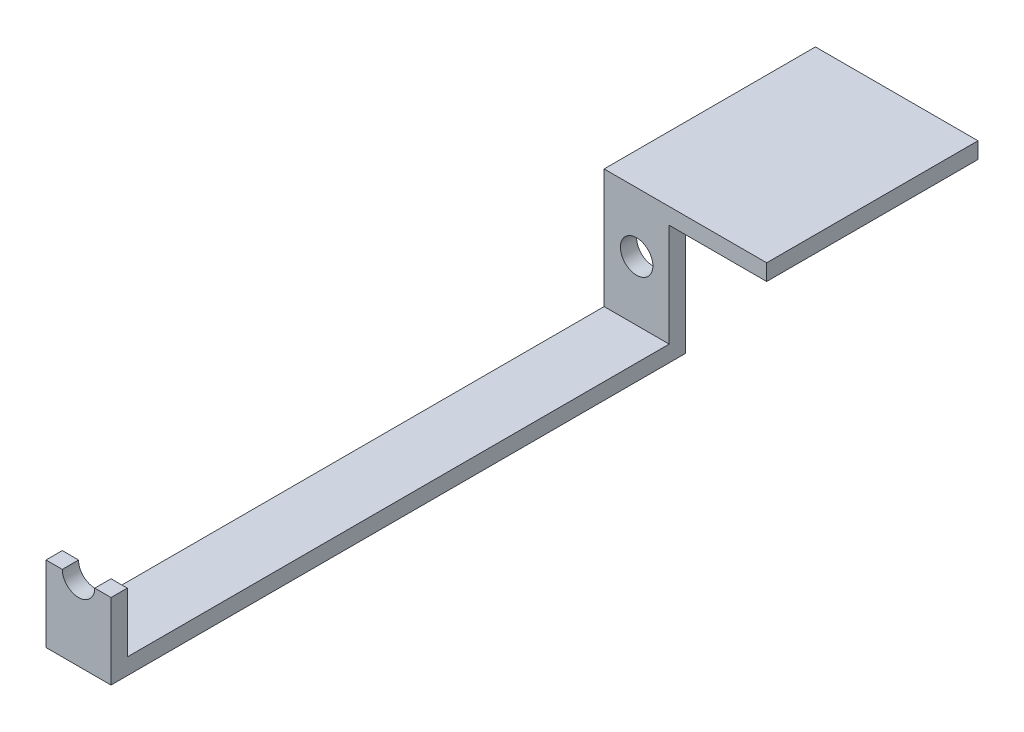
ISO-10303-21;
HEADER;
FILE_DESCRIPTION(('STEP AP214'),'2;1');
FILE_NAME('part.step','',(''),(''),'','','');
FILE_SCHEMA(('AUTOMOTIVE_DESIGN { 1 0 10303 214 1 1 1 1 }'));
ENDSEC;
DATA;
#1=APPLICATION_CONTEXT('core data for automotive mechanical design processes');
#2=APPLICATION_PROTOCOL_DEFINITION('international standard','automotive_design',2000,#1);
#3=PRODUCT_CONTEXT('',#1,'mechanical');
#4=PRODUCT('Part','Part','',(#3));
#5=PRODUCT_RELATED_PRODUCT_CATEGORY('part','',(#4));
#6=PRODUCT_DEFINITION_FORMATION('','',#4);
#7=PRODUCT_DEFINITION_CONTEXT('part definition',#1,'design');
#8=PRODUCT_DEFINITION('design','',#6,#7);
#9=PRODUCT_DEFINITION_SHAPE('','',#8);
#10=(LENGTH_UNIT() NAMED_UNIT(*) SI_UNIT(.MILLI.,.METRE.));
#11=(NAMED_UNIT(*) PLANE_ANGLE_UNIT() SI_UNIT($,.RADIAN.));
#12=(NAMED_UNIT(*) SI_UNIT($,.STERADIAN.) SOLID_ANGLE_UNIT());
#13=UNCERTAINTY_MEASURE_WITH_UNIT(LENGTH_MEASURE(1.E-05),#10,'distance_accuracy_value','');
#14=(GEOMETRIC_REPRESENTATION_CONTEXT(3) GLOBAL_UNCERTAINTY_ASSIGNED_CONTEXT((#13)) GLOBAL_UNIT_ASSIGNED_CONTEXT((#10,
#11,#12)) REPRESENTATION_CONTEXT('',''));
#15=CARTESIAN_POINT('',(0.,0.,0.));
#16=DIRECTION('',(0.,0.,1.));
#17=DIRECTION('',(1.,0.,0.));
#18=AXIS2_PLACEMENT_3D('',#15,#16,#17);
#19=CARTESIAN_POINT('',(12.,0.,0.));
#20=DIRECTION('',(-1.,0.,0.));
#21=DIRECTION('',(0.,0.,1.));
#22=AXIS2_PLACEMENT_3D('',#19,#20,#21);
#23=PLANE('',#22);
#24=DIRECTION('',(0.,0.,-1.));
#25=VECTOR('',#24,1.);
#26=CARTESIAN_POINT('',(12.,22.,-89.));
#27=LINE('',#26,#25);
#28=CARTESIAN_POINT('',(12.,22.,-50.));
#29=VERTEX_POINT('',#28);
#30=CARTESIAN_POINT('',(12.,22.,-53.));
#31=VERTEX_POINT('',#30);
#32=EDGE_CURVE('E52',#29,#31,#27,.T.);
#33=ORIENTED_EDGE('',*,*,#32,.F.);
#34=DIRECTION('',(0.,-1.,0.));
#35=VECTOR('',#34,1.);
#36=CARTESIAN_POINT('',(12.,20.,-50.));
#37=LINE('',#36,#35);
#38=CARTESIAN_POINT('',(12.,3.00000000000001,-50.));
#39=VERTEX_POINT('',#38);
#40=EDGE_CURVE('E192',#29,#39,#37,.T.);
#41=ORIENTED_EDGE('',*,*,#40,.T.);
#42=DIRECTION('',(0.,0.,1.));
#43=VECTOR('',#42,1.);
#44=CARTESIAN_POINT('',(12.,3.00000000000001,-50.));
#45=LINE('',#44,#43);
#46=CARTESIAN_POINT('',(12.,3.00000000000001,50.));
#47=VERTEX_POINT('',#46);
#48=EDGE_CURVE('E189',#39,#47,#45,.T.);
#49=ORIENTED_EDGE('',*,*,#48,.T.);
#50=DIRECTION('',(0.,1.,0.));
#51=VECTOR('',#50,1.);
#52=CARTESIAN_POINT('',(12.,14.,50.));
#53=LINE('',#52,#51);
#54=CARTESIAN_POINT('',(12.,14.,50.));
#55=VERTEX_POINT('',#54);
#56=EDGE_CURVE('E215',#47,#55,#53,.T.);
#57=ORIENTED_EDGE('',*,*,#56,.T.);
#58=DIRECTION('',(0.,0.,1.));
#59=VECTOR('',#58,1.);
#60=CARTESIAN_POINT('',(12.,14.,53.));
#61=LINE('',#60,#59);
#62=CARTESIAN_POINT('',(12.,14.,53.));
#63=VERTEX_POINT('',#62);
#64=EDGE_CURVE('E178',#55,#63,#61,.T.);
#65=ORIENTED_EDGE('',*,*,#64,.T.);
#66=DIRECTION('',(0.,-1.,0.));
#67=VECTOR('',#66,1.);
#68=CARTESIAN_POINT('',(12.,0.,53.));
#69=LINE('',#68,#67);
#70=CARTESIAN_POINT('',(12.,0.,53.));
#71=VERTEX_POINT('',#70);
#72=EDGE_CURVE('E181',#63,#71,#69,.T.);
#73=ORIENTED_EDGE('',*,*,#72,.T.);
#74=DIRECTION('',(0.,0.,-1.));
#75=VECTOR('',#74,1.);
#76=CARTESIAN_POINT('',(12.,0.,53.));
#77=LINE('',#76,#75);
#78=CARTESIAN_POINT('',(12.,0.,-53.));
#79=VERTEX_POINT('',#78);
#80=EDGE_CURVE('E184',#71,#79,#77,.T.);
#81=ORIENTED_EDGE('',*,*,#80,.T.);
#82=DIRECTION('',(0.,1.,0.));
#83=VECTOR('',#82,1.);
#84=CARTESIAN_POINT('',(12.,0.,-53.));
#85=LINE('',#84,#83);
#86=EDGE_CURVE('E186',#79,#31,#85,.T.);
#87=ORIENTED_EDGE('',*,*,#86,.T.);
#88=EDGE_LOOP('',(#33,#41,#49,#57,#65,#73,#81,#87));
#89=FACE_BOUND('',#88,.T.);
#90=ADVANCED_FACE('F35',(#89),#23,.F.);
#91=CARTESIAN_POINT('',(12.,14.,53.));
#92=DIRECTION('',(0.,-1.,0.));
#93=DIRECTION('',(0.,0.,-1.));
#94=AXIS2_PLACEMENT_3D('',#91,#92,#93);
#95=PLANE('',#94);
#96=DIRECTION('',(-1.,0.,0.));
#97=VECTOR('',#96,1.);
#98=CARTESIAN_POINT('',(12.,14.,53.));
#99=LINE('',#98,#97);
#100=CARTESIAN_POINT('',(3.,14.,53.));
#101=VERTEX_POINT('',#100);
#102=CARTESIAN_POINT('',(0.,14.,53.));
#103=VERTEX_POINT('',#102);
#104=EDGE_CURVE('E260',#101,#103,#99,.T.);
#105=ORIENTED_EDGE('',*,*,#104,.F.);
#106=DIRECTION('',(0.,0.,-1.));
#107=VECTOR('',#106,1.);
#108=CARTESIAN_POINT('',(3.,14.,61.4852813742386));
#109=LINE('',#108,#107);
#110=CARTESIAN_POINT('',(3.,14.,50.));
#111=VERTEX_POINT('',#110);
#112=EDGE_CURVE('E171',#101,#111,#109,.T.);
#113=ORIENTED_EDGE('',*,*,#112,.T.);
#114=DIRECTION('',(-1.,0.,0.));
#115=VECTOR('',#114,1.);
#116=CARTESIAN_POINT('',(12.,14.,50.));
#117=LINE('',#116,#115);
#118=CARTESIAN_POINT('',(0.,14.,50.));
#119=VERTEX_POINT('',#118);
#120=EDGE_CURVE('E232',#111,#119,#117,.T.);
#121=ORIENTED_EDGE('',*,*,#120,.T.);
#122=DIRECTION('',(0.,0.,1.));
#123=VECTOR('',#122,1.);
#124=CARTESIAN_POINT('',(0.,14.,53.));
#125=LINE('',#124,#123);
#126=EDGE_CURVE('E177',#119,#103,#125,.T.);
#127=ORIENTED_EDGE('',*,*,#126,.T.);
#128=EDGE_LOOP('',(#105,#113,#121,#127));
#129=FACE_BOUND('',#128,.T.);
#130=ADVANCED_FACE('F274',(#129),#95,.F.);
#131=CARTESIAN_POINT('',(9.,14.,50.));
#132=VERTEX_POINT('',#131);
#133=EDGE_CURVE('E226',#55,#132,#117,.T.);
#134=ORIENTED_EDGE('',*,*,#133,.T.);
#135=DIRECTION('',(0.,0.,-1.));
#136=VECTOR('',#135,1.);
#137=CARTESIAN_POINT('',(9.,14.,61.4852813742386));
#138=LINE('',#137,#136);
#139=CARTESIAN_POINT('',(9.,14.,53.));
#140=VERTEX_POINT('',#139);
#141=EDGE_CURVE('E60',#132,#140,#138,.F.);
#142=ORIENTED_EDGE('',*,*,#141,.T.);
#143=EDGE_CURVE('E44',#63,#140,#99,.T.);
#144=ORIENTED_EDGE('',*,*,#143,.F.);
#145=ORIENTED_EDGE('',*,*,#64,.F.);
#146=EDGE_LOOP('',(#134,#142,#144,#145));
#147=FACE_BOUND('',#146,.T.);
#148=ADVANCED_FACE('F37',(#147),#95,.F.);
#149=CARTESIAN_POINT('',(12.,0.,53.));
#150=DIRECTION('',(0.,0.,-1.));
#151=DIRECTION('',(-1.,0.,0.));
#152=AXIS2_PLACEMENT_3D('',#149,#150,#151);
#153=PLANE('',#152);
#154=ORIENTED_EDGE('',*,*,#143,.T.);
#155=CARTESIAN_POINT('',(6.,14.,53.));
#156=DIRECTION('',(0.,0.,-1.));
#157=DIRECTION('',(-1.,0.,0.));
#158=AXIS2_PLACEMENT_3D('',#155,#156,#157);
#159=CIRCLE('',#158,3.);
#160=EDGE_CURVE('E168',#101,#140,#159,.F.);
#161=ORIENTED_EDGE('',*,*,#160,.F.);
#162=ORIENTED_EDGE('',*,*,#104,.T.);
#163=DIRECTION('',(0.,-1.,0.));
#164=VECTOR('',#163,1.);
#165=CARTESIAN_POINT('',(0.,0.,53.));
#166=LINE('',#165,#164);
#167=CARTESIAN_POINT('',(0.,0.,53.));
#168=VERTEX_POINT('',#167);
#169=EDGE_CURVE('E237',#103,#168,#166,.T.);
#170=ORIENTED_EDGE('',*,*,#169,.T.);
#171=DIRECTION('',(-1.,0.,0.));
#172=VECTOR('',#171,1.);
#173=CARTESIAN_POINT('',(12.,0.,53.));
#174=LINE('',#173,#172);
#175=EDGE_CURVE('E258',#71,#168,#174,.T.);
#176=ORIENTED_EDGE('',*,*,#175,.F.);
#177=ORIENTED_EDGE('',*,*,#72,.F.);
#178=EDGE_LOOP('',(#154,#161,#162,#170,#176,#177));
#179=FACE_BOUND('',#178,.T.);
#180=ADVANCED_FACE('F267',(#179),#153,.F.);
#181=CARTESIAN_POINT('',(12.,0.,53.));
#182=DIRECTION('',(0.,1.,0.));
#183=DIRECTION('',(0.,0.,1.));
#184=AXIS2_PLACEMENT_3D('',#181,#182,#183);
#185=PLANE('',#184);
#186=DIRECTION('',(0.,0.,-1.));
#187=VECTOR('',#186,1.);
#188=CARTESIAN_POINT('',(0.,0.,53.));
#189=LINE('',#188,#187);
#190=CARTESIAN_POINT('',(0.,0.,-53.));
#191=VERTEX_POINT('',#190);
#192=EDGE_CURVE('E239',#168,#191,#189,.T.);
#193=ORIENTED_EDGE('',*,*,#192,.T.);
#194=DIRECTION('',(-1.,0.,0.));
#195=VECTOR('',#194,1.);
#196=CARTESIAN_POINT('',(12.,0.,-53.));
#197=LINE('',#196,#195);
#198=EDGE_CURVE('E201',#79,#191,#197,.T.);
#199=ORIENTED_EDGE('',*,*,#198,.F.);
#200=ORIENTED_EDGE('',*,*,#80,.F.);
#201=ORIENTED_EDGE('',*,*,#175,.T.);
#202=EDGE_LOOP('',(#193,#199,#200,#201));
#203=FACE_BOUND('',#202,.T.);
#204=ADVANCED_FACE('F283',(#203),#185,.F.);
#205=CARTESIAN_POINT('',(12.,22.,-53.));
#206=DIRECTION('',(0.,0.,1.));
#207=DIRECTION('',(1.,0.,0.));
#208=AXIS2_PLACEMENT_3D('',#205,#206,#207);
#209=PLANE('',#208);
#210=CARTESIAN_POINT('',(6.,14.,-53.));
#211=DIRECTION('',(0.,0.,-1.));
#212=DIRECTION('',(-1.,0.,0.));
#213=AXIS2_PLACEMENT_3D('',#210,#211,#212);
#214=CIRCLE('',#213,3.);
#215=CARTESIAN_POINT('',(3.,14.,-53.));
#216=VERTEX_POINT('',#215);
#217=EDGE_CURVE('E165',#216,#216,#214,.T.);
#218=ORIENTED_EDGE('',*,*,#217,.F.);
#219=EDGE_LOOP('',(#218));
#220=FACE_BOUND('',#219,.T.);
#221=DIRECTION('',(0.,1.,0.));
#222=VECTOR('',#221,1.);
#223=CARTESIAN_POINT('',(0.,22.,-53.));
#224=LINE('',#223,#222);
#225=CARTESIAN_POINT('',(0.,22.,-53.));
#226=VERTEX_POINT('',#225);
#227=EDGE_CURVE('E242',#191,#226,#224,.T.);
#228=ORIENTED_EDGE('',*,*,#227,.T.);
#229=DIRECTION('',(-1.,0.,0.));
#230=VECTOR('',#229,1.);
#231=CARTESIAN_POINT('',(12.,22.,-53.));
#232=LINE('',#231,#230);
#233=EDGE_CURVE('E198',#31,#226,#232,.T.);
#234=ORIENTED_EDGE('',*,*,#233,.F.);
#235=ORIENTED_EDGE('',*,*,#86,.F.);
#236=ORIENTED_EDGE('',*,*,#198,.T.);
#237=EDGE_LOOP('',(#228,#234,#235,#236));
#238=FACE_BOUND('',#237,.T.);
#239=ADVANCED_FACE('F279',(#220,#238),#209,.F.);
#240=CARTESIAN_POINT('',(12.,22.,-89.));
#241=DIRECTION('',(0.,1.,0.));
#242=DIRECTION('',(0.,0.,1.));
#243=AXIS2_PLACEMENT_3D('',#240,#241,#242);
#244=PLANE('',#243);
#245=DIRECTION('',(0.,0.,-1.));
#246=VECTOR('',#245,1.);
#247=CARTESIAN_POINT('',(0.,22.,-89.));
#248=LINE('',#247,#246);
#249=CARTESIAN_POINT('',(0.,22.,-89.));
#250=VERTEX_POINT('',#249);
#251=EDGE_CURVE('E244',#226,#250,#248,.T.);
#252=ORIENTED_EDGE('',*,*,#251,.T.);
#253=DIRECTION('',(-1.,0.,0.));
#254=VECTOR('',#253,1.);
#255=CARTESIAN_POINT('',(12.,22.,-89.));
#256=LINE('',#255,#254);
#257=CARTESIAN_POINT('',(30.,22.,-89.));
#258=VERTEX_POINT('',#257);
#259=EDGE_CURVE('E142',#258,#250,#256,.T.);
#260=ORIENTED_EDGE('',*,*,#259,.F.);
#261=DIRECTION('',(0.,0.,-1.));
#262=VECTOR('',#261,1.);
#263=CARTESIAN_POINT('',(30.,22.,-89.));
#264=LINE('',#263,#262);
#265=CARTESIAN_POINT('',(30.,22.,-50.));
#266=VERTEX_POINT('',#265);
#267=EDGE_CURVE('E156',#266,#258,#264,.T.);
#268=ORIENTED_EDGE('',*,*,#267,.F.);
#269=DIRECTION('',(-1.,0.,0.));
#270=VECTOR('',#269,1.);
#271=CARTESIAN_POINT('',(30.,22.,-50.));
#272=LINE('',#271,#270);
#273=EDGE_CURVE('E162',#266,#29,#272,.T.);
#274=ORIENTED_EDGE('',*,*,#273,.T.);
#275=ORIENTED_EDGE('',*,*,#32,.T.);
#276=ORIENTED_EDGE('',*,*,#233,.T.);
#277=EDGE_LOOP('',(#252,#260,#268,#274,#275,#276));
#278=FACE_BOUND('',#277,.T.);
#279=ADVANCED_FACE('F206',(#278),#244,.F.);
#280=CARTESIAN_POINT('',(12.,25.,-89.));
#281=DIRECTION('',(0.,0.,1.));
#282=DIRECTION('',(1.,0.,0.));
#283=AXIS2_PLACEMENT_3D('',#280,#281,#282);
#284=PLANE('',#283);
#285=DIRECTION('',(0.,1.,0.));
#286=VECTOR('',#285,1.);
#287=CARTESIAN_POINT('',(0.,25.,-89.));
#288=LINE('',#287,#286);
#289=CARTESIAN_POINT('',(0.,25.,-89.));
#290=VERTEX_POINT('',#289);
#291=EDGE_CURVE('E138',#250,#290,#288,.T.);
#292=ORIENTED_EDGE('',*,*,#291,.T.);
#293=DIRECTION('',(-1.,0.,0.));
#294=VECTOR('',#293,1.);
#295=CARTESIAN_POINT('',(12.,25.,-89.));
#296=LINE('',#295,#294);
#297=CARTESIAN_POINT('',(30.,25.,-89.));
#298=VERTEX_POINT('',#297);
#299=EDGE_CURVE('E131',#298,#290,#296,.T.);
#300=ORIENTED_EDGE('',*,*,#299,.F.);
#301=DIRECTION('',(0.,1.,0.));
#302=VECTOR('',#301,1.);
#303=CARTESIAN_POINT('',(30.,22.,-89.));
#304=LINE('',#303,#302);
#305=EDGE_CURVE('E136',#258,#298,#304,.T.);
#306=ORIENTED_EDGE('',*,*,#305,.F.);
#307=ORIENTED_EDGE('',*,*,#259,.T.);
#308=EDGE_LOOP('',(#292,#300,#306,#307));
#309=FACE_BOUND('',#308,.T.);
#310=ADVANCED_FACE('F133',(#309),#284,.F.);
#311=CARTESIAN_POINT('',(12.,25.,-50.));
#312=DIRECTION('',(0.,-1.,0.));
#313=DIRECTION('',(0.,0.,-1.));
#314=AXIS2_PLACEMENT_3D('',#311,#312,#313);
#315=PLANE('',#314);
#316=DIRECTION('',(0.,0.,1.));
#317=VECTOR('',#316,1.);
#318=CARTESIAN_POINT('',(0.,25.,-50.));
#319=LINE('',#318,#317);
#320=CARTESIAN_POINT('',(0.,25.,-50.));
#321=VERTEX_POINT('',#320);
#322=EDGE_CURVE('E247',#290,#321,#319,.T.);
#323=ORIENTED_EDGE('',*,*,#322,.T.);
#324=DIRECTION('',(-1.,0.,0.));
#325=VECTOR('',#324,1.);
#326=CARTESIAN_POINT('',(12.,25.,-50.));
#327=LINE('',#326,#325);
#328=CARTESIAN_POINT('',(30.,25.,-50.));
#329=VERTEX_POINT('',#328);
#330=EDGE_CURVE('E143',#329,#321,#327,.T.);
#331=ORIENTED_EDGE('',*,*,#330,.F.);
#332=DIRECTION('',(0.,0.,1.));
#333=VECTOR('',#332,1.);
#334=CARTESIAN_POINT('',(30.,25.,-89.));
#335=LINE('',#334,#333);
#336=EDGE_CURVE('E146',#298,#329,#335,.T.);
#337=ORIENTED_EDGE('',*,*,#336,.F.);
#338=ORIENTED_EDGE('',*,*,#299,.T.);
#339=EDGE_LOOP('',(#323,#331,#337,#338));
#340=FACE_BOUND('',#339,.T.);
#341=ADVANCED_FACE('F147',(#340),#315,.F.);
#342=CARTESIAN_POINT('',(12.,20.,-50.));
#343=DIRECTION('',(0.,0.,-1.));
#344=DIRECTION('',(0.,1.,0.));
#345=AXIS2_PLACEMENT_3D('',#342,#343,#344);
#346=PLANE('',#345);
#347=CARTESIAN_POINT('',(6.,14.,-50.));
#348=DIRECTION('',(0.,0.,-1.));
#349=DIRECTION('',(0.,1.,0.));
#350=AXIS2_PLACEMENT_3D('',#347,#348,#349);
#351=CIRCLE('',#350,3.);
#352=CARTESIAN_POINT('',(6.,17.,-50.));
#353=VERTEX_POINT('',#352);
#354=EDGE_CURVE('E174',#353,#353,#351,.T.);
#355=ORIENTED_EDGE('',*,*,#354,.T.);
#356=EDGE_LOOP('',(#355));
#357=FACE_BOUND('',#356,.T.);
#358=DIRECTION('',(0.,-1.,0.));
#359=VECTOR('',#358,1.);
#360=CARTESIAN_POINT('',(0.,20.,-50.));
#361=LINE('',#360,#359);
#362=CARTESIAN_POINT('',(0.,3.00000000000001,-50.));
#363=VERTEX_POINT('',#362);
#364=EDGE_CURVE('E249',#321,#363,#361,.T.);
#365=ORIENTED_EDGE('',*,*,#364,.T.);
#366=DIRECTION('',(-1.,0.,0.));
#367=VECTOR('',#366,1.);
#368=CARTESIAN_POINT('',(12.,3.00000000000001,-50.));
#369=LINE('',#368,#367);
#370=EDGE_CURVE('E211',#39,#363,#369,.T.);
#371=ORIENTED_EDGE('',*,*,#370,.F.);
#372=ORIENTED_EDGE('',*,*,#40,.F.);
#373=ORIENTED_EDGE('',*,*,#273,.F.);
#374=DIRECTION('',(0.,-1.,0.));
#375=VECTOR('',#374,1.);
#376=CARTESIAN_POINT('',(30.,22.,-50.));
#377=LINE('',#376,#375);
#378=EDGE_CURVE('E151',#329,#266,#377,.T.);
#379=ORIENTED_EDGE('',*,*,#378,.F.);
#380=ORIENTED_EDGE('',*,*,#330,.T.);
#381=EDGE_LOOP('',(#365,#371,#372,#373,#379,#380));
#382=FACE_BOUND('',#381,.T.);
#383=ADVANCED_FACE('F208',(#357,#382),#346,.F.);
#384=CARTESIAN_POINT('',(12.,3.00000000000001,-50.));
#385=DIRECTION('',(0.,-1.,0.));
#386=DIRECTION('',(0.,0.,-1.));
#387=AXIS2_PLACEMENT_3D('',#384,#385,#386);
#388=PLANE('',#387);
#389=DIRECTION('',(0.,0.,1.));
#390=VECTOR('',#389,1.);
#391=CARTESIAN_POINT('',(0.,3.00000000000001,-50.));
#392=LINE('',#391,#390);
#393=CARTESIAN_POINT('',(0.,3.00000000000001,50.));
#394=VERTEX_POINT('',#393);
#395=EDGE_CURVE('E222',#363,#394,#392,.T.);
#396=ORIENTED_EDGE('',*,*,#395,.T.);
#397=DIRECTION('',(-1.,0.,0.));
#398=VECTOR('',#397,1.);
#399=CARTESIAN_POINT('',(12.,3.00000000000001,50.));
#400=LINE('',#399,#398);
#401=EDGE_CURVE('E219',#47,#394,#400,.T.);
#402=ORIENTED_EDGE('',*,*,#401,.F.);
#403=ORIENTED_EDGE('',*,*,#48,.F.);
#404=ORIENTED_EDGE('',*,*,#370,.T.);
#405=EDGE_LOOP('',(#396,#402,#403,#404));
#406=FACE_BOUND('',#405,.T.);
#407=ADVANCED_FACE('F220',(#406),#388,.F.);
#408=CARTESIAN_POINT('',(12.,14.,50.));
#409=DIRECTION('',(0.,0.,1.));
#410=DIRECTION('',(0.,-1.,0.));
#411=AXIS2_PLACEMENT_3D('',#408,#409,#410);
#412=PLANE('',#411);
#413=ORIENTED_EDGE('',*,*,#120,.F.);
#414=CARTESIAN_POINT('',(6.,14.,50.));
#415=DIRECTION('',(0.,0.,1.));
#416=DIRECTION('',(0.,-1.,0.));
#417=AXIS2_PLACEMENT_3D('',#414,#415,#416);
#418=CIRCLE('',#417,3.);
#419=EDGE_CURVE('E11',#111,#132,#418,.T.);
#420=ORIENTED_EDGE('',*,*,#419,.T.);
#421=ORIENTED_EDGE('',*,*,#133,.F.);
#422=ORIENTED_EDGE('',*,*,#56,.F.);
#423=ORIENTED_EDGE('',*,*,#401,.T.);
#424=DIRECTION('',(0.,1.,0.));
#425=VECTOR('',#424,1.);
#426=CARTESIAN_POINT('',(0.,14.,50.));
#427=LINE('',#426,#425);
#428=EDGE_CURVE('E182',#394,#119,#427,.T.);
#429=ORIENTED_EDGE('',*,*,#428,.T.);
#430=EDGE_LOOP('',(#413,#420,#421,#422,#423,#429));
#431=FACE_BOUND('',#430,.T.);
#432=ADVANCED_FACE('F229',(#431),#412,.F.);
#433=CARTESIAN_POINT('',(0.,0.,0.));
#434=DIRECTION('',(-1.,0.,0.));
#435=DIRECTION('',(0.,0.,1.));
#436=AXIS2_PLACEMENT_3D('',#433,#434,#435);
#437=PLANE('',#436);
#438=ORIENTED_EDGE('',*,*,#126,.F.);
#439=ORIENTED_EDGE('',*,*,#428,.F.);
#440=ORIENTED_EDGE('',*,*,#395,.F.);
#441=ORIENTED_EDGE('',*,*,#364,.F.);
#442=ORIENTED_EDGE('',*,*,#322,.F.);
#443=ORIENTED_EDGE('',*,*,#291,.F.);
#444=ORIENTED_EDGE('',*,*,#251,.F.);
#445=ORIENTED_EDGE('',*,*,#227,.F.);
#446=ORIENTED_EDGE('',*,*,#192,.F.);
#447=ORIENTED_EDGE('',*,*,#169,.F.);
#448=EDGE_LOOP('',(#438,#439,#440,#441,#442,#443,#444,#445,#446,#447));
#449=FACE_BOUND('',#448,.T.);
#450=ADVANCED_FACE('F273',(#449),#437,.T.);
#451=CARTESIAN_POINT('',(6.,14.,61.4852813742386));
#452=DIRECTION('',(0.,0.,-1.));
#453=DIRECTION('',(-1.,0.,0.));
#454=AXIS2_PLACEMENT_3D('',#451,#452,#453);
#455=CYLINDRICAL_SURFACE('',#454,3.);
#456=ORIENTED_EDGE('',*,*,#160,.T.);
#457=ORIENTED_EDGE('',*,*,#141,.F.);
#458=ORIENTED_EDGE('',*,*,#419,.F.);
#459=ORIENTED_EDGE('',*,*,#112,.F.);
#460=EDGE_LOOP('',(#456,#457,#458,#459));
#461=FACE_BOUND('',#460,.T.);
#462=ADVANCED_FACE('F300',(#461),#455,.F.);
#463=ORIENTED_EDGE('',*,*,#217,.T.);
#464=EDGE_LOOP('',(#463));
#465=FACE_BOUND('',#464,.T.);
#466=ORIENTED_EDGE('',*,*,#354,.F.);
#467=EDGE_LOOP('',(#466));
#468=FACE_BOUND('',#467,.T.);
#469=ADVANCED_FACE('F296',(#465,#468),#455,.F.);
#470=CARTESIAN_POINT('',(30.,0.,0.));
#471=DIRECTION('',(1.,0.,0.));
#472=DIRECTION('',(0.,0.,-1.));
#473=AXIS2_PLACEMENT_3D('',#470,#471,#472);
#474=PLANE('',#473);
#475=ORIENTED_EDGE('',*,*,#305,.T.);
#476=ORIENTED_EDGE('',*,*,#336,.T.);
#477=ORIENTED_EDGE('',*,*,#378,.T.);
#478=ORIENTED_EDGE('',*,*,#267,.T.);
#479=EDGE_LOOP('',(#475,#476,#477,#478));
#480=FACE_BOUND('',#479,.T.);
#481=ADVANCED_FACE('F154',(#480),#474,.T.);
#482=CLOSED_SHELL('',(#90,#130,#148,#180,#204,#239,#279,#310,#341,#383,#407,#432,#450,#462,#469,#481));
#483=MANIFOLD_SOLID_BREP('B2',#482);
#484=ADVANCED_BREP_SHAPE_REPRESENTATION('',(#18,#483),#14);
#485=SHAPE_DEFINITION_REPRESENTATION(#9,#484);
ENDSEC;
END-ISO-10303-21;
